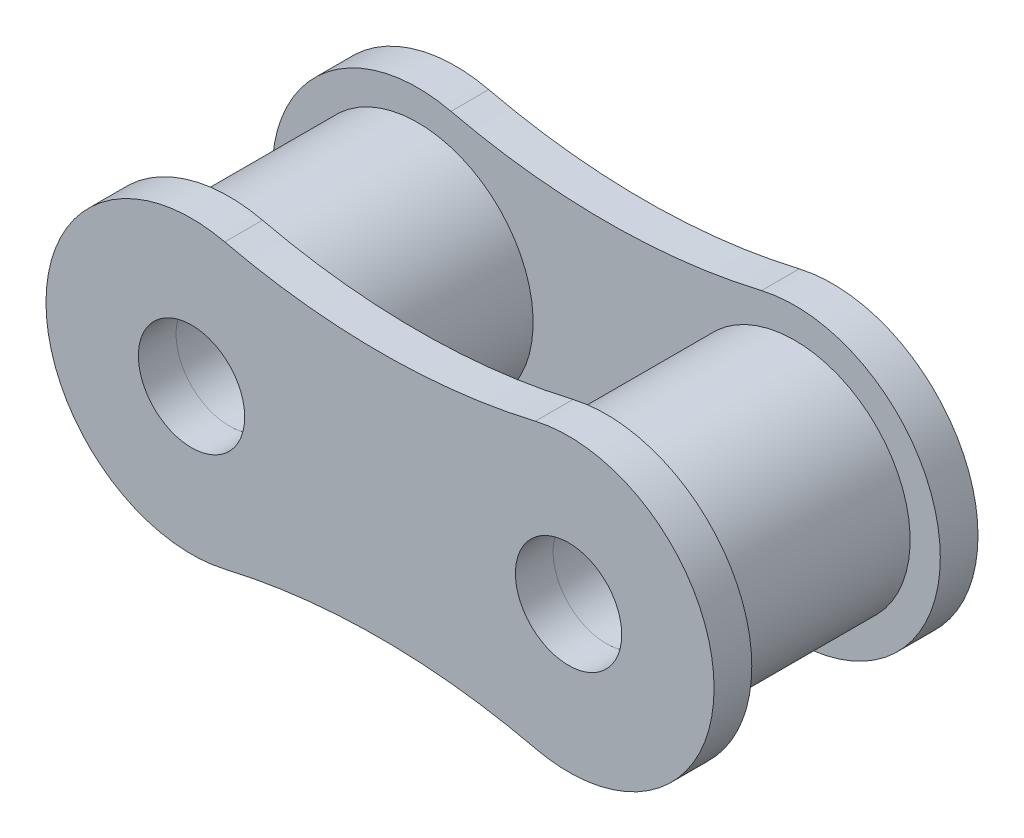
ISO-10303-21;
HEADER;
FILE_DESCRIPTION(('STEP AP214'),'2;1');
FILE_NAME('part.step','',(''),(''),'','','');
FILE_SCHEMA(('AUTOMOTIVE_DESIGN { 1 0 10303 214 1 1 1 1 }'));
ENDSEC;
DATA;
#1=APPLICATION_CONTEXT('core data for automotive mechanical design processes');
#2=APPLICATION_PROTOCOL_DEFINITION('international standard','automotive_design',2000,#1);
#3=PRODUCT_CONTEXT('',#1,'mechanical');
#4=PRODUCT('Part','Part','',(#3));
#5=PRODUCT_RELATED_PRODUCT_CATEGORY('part','',(#4));
#6=PRODUCT_DEFINITION_FORMATION('','',#4);
#7=PRODUCT_DEFINITION_CONTEXT('part definition',#1,'design');
#8=PRODUCT_DEFINITION('design','',#6,#7);
#9=PRODUCT_DEFINITION_SHAPE('','',#8);
#10=(LENGTH_UNIT() NAMED_UNIT(*) SI_UNIT(.MILLI.,.METRE.));
#11=(NAMED_UNIT(*) PLANE_ANGLE_UNIT() SI_UNIT($,.RADIAN.));
#12=(NAMED_UNIT(*) SI_UNIT($,.STERADIAN.) SOLID_ANGLE_UNIT());
#13=UNCERTAINTY_MEASURE_WITH_UNIT(LENGTH_MEASURE(1.E-05),#10,'distance_accuracy_value','');
#14=(GEOMETRIC_REPRESENTATION_CONTEXT(3) GLOBAL_UNCERTAINTY_ASSIGNED_CONTEXT((#13)) GLOBAL_UNIT_ASSIGNED_CONTEXT((#10,
#11,#12)) REPRESENTATION_CONTEXT('',''));
#15=CARTESIAN_POINT('',(0.,0.,0.));
#16=DIRECTION('',(0.,0.,1.));
#17=DIRECTION('',(1.,0.,0.));
#18=AXIS2_PLACEMENT_3D('',#15,#16,#17);
#19=CARTESIAN_POINT('',(3.175,13.5251485017271,-3.175));
#20=DIRECTION('',(0.,0.,-1.));
#21=DIRECTION('',(1.,0.,0.));
#22=AXIS2_PLACEMENT_3D('',#19,#20,#21);
#23=PLANE('',#22);
#24=CARTESIAN_POINT('',(0.,27.0502970034543,-3.175));
#25=DIRECTION('',(0.,0.,-1.));
#26=DIRECTION('',(1.,0.,0.));
#27=AXIS2_PLACEMENT_3D('',#24,#25,#26);
#28=CIRCLE('',#27,22.8834270034543);
#29=CARTESIAN_POINT('',(5.22967365299584,4.77246620901692,-3.175));
#30=VERTEX_POINT('',#29);
#31=CARTESIAN_POINT('',(-5.22967365299584,4.77246620901692,-3.175));
#32=VERTEX_POINT('',#31);
#33=EDGE_CURVE('E155',#30,#32,#28,.T.);
#34=ORIENTED_EDGE('',*,*,#33,.T.);
#35=CARTESIAN_POINT('',(-6.35,0.,-3.175));
#36=DIRECTION('',(0.,0.,1.));
#37=DIRECTION('',(1.,0.,0.));
#38=AXIS2_PLACEMENT_3D('',#35,#36,#37);
#39=CIRCLE('',#38,4.9022);
#40=CARTESIAN_POINT('',(-5.22967365299584,-4.77246620901692,-3.175));
#41=VERTEX_POINT('',#40);
#42=EDGE_CURVE('E169',#32,#41,#39,.T.);
#43=ORIENTED_EDGE('',*,*,#42,.T.);
#44=CARTESIAN_POINT('',(0.,-27.0502970034543,-3.175));
#45=DIRECTION('',(0.,0.,-1.));
#46=DIRECTION('',(1.,0.,0.));
#47=AXIS2_PLACEMENT_3D('',#44,#45,#46);
#48=CIRCLE('',#47,22.8834270034543);
#49=CARTESIAN_POINT('',(5.22967365299584,-4.77246620901691,-3.175));
#50=VERTEX_POINT('',#49);
#51=EDGE_CURVE('E172',#41,#50,#48,.T.);
#52=ORIENTED_EDGE('',*,*,#51,.T.);
#53=CARTESIAN_POINT('',(6.35,0.,-3.175));
#54=DIRECTION('',(0.,0.,1.));
#55=DIRECTION('',(1.,0.,0.));
#56=AXIS2_PLACEMENT_3D('',#53,#54,#55);
#57=CIRCLE('',#56,4.9022);
#58=EDGE_CURVE('E161',#50,#30,#57,.T.);
#59=ORIENTED_EDGE('',*,*,#58,.T.);
#60=EDGE_LOOP('',(#34,#43,#52,#59));
#61=FACE_BOUND('',#60,.T.);
#62=CARTESIAN_POINT('',(-6.35,0.,-3.175));
#63=DIRECTION('',(0.,0.,-1.));
#64=DIRECTION('',(-1.,0.,0.));
#65=AXIS2_PLACEMENT_3D('',#62,#63,#64);
#66=CIRCLE('',#65,3.8862);
#67=CARTESIAN_POINT('',(-10.2362,0.,-3.175));
#68=VERTEX_POINT('',#67);
#69=EDGE_CURVE('E43',#68,#68,#66,.F.);
#70=ORIENTED_EDGE('',*,*,#69,.F.);
#71=EDGE_LOOP('',(#70));
#72=FACE_BOUND('',#71,.T.);
#73=CARTESIAN_POINT('',(6.35,0.,-3.175));
#74=DIRECTION('',(0.,0.,-1.));
#75=DIRECTION('',(-1.,0.,0.));
#76=AXIS2_PLACEMENT_3D('',#73,#74,#75);
#77=CIRCLE('',#76,3.8862);
#78=CARTESIAN_POINT('',(2.4638,0.,-3.175));
#79=VERTEX_POINT('',#78);
#80=EDGE_CURVE('E11',#79,#79,#77,.F.);
#81=ORIENTED_EDGE('',*,*,#80,.F.);
#82=EDGE_LOOP('',(#81));
#83=FACE_BOUND('',#82,.T.);
#84=ADVANCED_FACE('F34',(#61,#72,#83),#23,.F.);
#85=CARTESIAN_POINT('',(6.35,0.,-3.175));
#86=DIRECTION('',(0.,0.,1.));
#87=DIRECTION('',(1.,0.,0.));
#88=AXIS2_PLACEMENT_3D('',#85,#86,#87);
#89=CIRCLE('',#88,1.8161);
#90=CARTESIAN_POINT('',(8.1661,0.,-3.175));
#91=VERTEX_POINT('',#90);
#92=EDGE_CURVE('E273',#91,#91,#89,.T.);
#93=ORIENTED_EDGE('',*,*,#92,.T.);
#94=EDGE_LOOP('',(#93));
#95=FACE_BOUND('',#94,.T.);
#96=CARTESIAN_POINT('',(6.35,0.,-3.175));
#97=DIRECTION('',(0.,0.,1.));
#98=DIRECTION('',(1.,0.,0.));
#99=AXIS2_PLACEMENT_3D('',#96,#97,#98);
#100=CIRCLE('',#99,1.7907);
#101=CARTESIAN_POINT('',(8.1407,0.,-3.175));
#102=VERTEX_POINT('',#101);
#103=EDGE_CURVE('E145',#102,#102,#100,.T.);
#104=ORIENTED_EDGE('',*,*,#103,.F.);
#105=EDGE_LOOP('',(#104));
#106=FACE_BOUND('',#105,.T.);
#107=ADVANCED_FACE('F187',(#95,#106),#23,.F.);
#108=CARTESIAN_POINT('',(3.175,13.5251485017271,-4.445));
#109=DIRECTION('',(0.,0.,-1.));
#110=DIRECTION('',(1.,0.,0.));
#111=AXIS2_PLACEMENT_3D('',#108,#109,#110);
#112=PLANE('',#111);
#113=CARTESIAN_POINT('',(-6.35,0.,-4.445));
#114=DIRECTION('',(0.,0.,1.));
#115=DIRECTION('',(1.,0.,0.));
#116=AXIS2_PLACEMENT_3D('',#113,#114,#115);
#117=CIRCLE('',#116,1.7907);
#118=CARTESIAN_POINT('',(-4.5593,0.,-4.445));
#119=VERTEX_POINT('',#118);
#120=EDGE_CURVE('E152',#119,#119,#117,.T.);
#121=ORIENTED_EDGE('',*,*,#120,.T.);
#122=EDGE_LOOP('',(#121));
#123=FACE_BOUND('',#122,.T.);
#124=CARTESIAN_POINT('',(0.,27.0502970034543,-4.445));
#125=DIRECTION('',(0.,0.,-1.));
#126=DIRECTION('',(1.,0.,0.));
#127=AXIS2_PLACEMENT_3D('',#124,#125,#126);
#128=CIRCLE('',#127,22.8834270034543);
#129=CARTESIAN_POINT('',(5.22967365299584,4.77246620901692,-4.445));
#130=VERTEX_POINT('',#129);
#131=CARTESIAN_POINT('',(-5.22967365299584,4.77246620901692,-4.445));
#132=VERTEX_POINT('',#131);
#133=EDGE_CURVE('E158',#130,#132,#128,.T.);
#134=ORIENTED_EDGE('',*,*,#133,.F.);
#135=CARTESIAN_POINT('',(6.35,0.,-4.445));
#136=DIRECTION('',(0.,0.,1.));
#137=DIRECTION('',(1.,0.,0.));
#138=AXIS2_PLACEMENT_3D('',#135,#136,#137);
#139=CIRCLE('',#138,4.9022);
#140=CARTESIAN_POINT('',(5.22967365299584,-4.77246620901691,-4.445));
#141=VERTEX_POINT('',#140);
#142=EDGE_CURVE('E165',#141,#130,#139,.T.);
#143=ORIENTED_EDGE('',*,*,#142,.F.);
#144=CARTESIAN_POINT('',(0.,-27.0502970034543,-4.445));
#145=DIRECTION('',(0.,0.,-1.));
#146=DIRECTION('',(1.,0.,0.));
#147=AXIS2_PLACEMENT_3D('',#144,#145,#146);
#148=CIRCLE('',#147,22.8834270034543);
#149=CARTESIAN_POINT('',(-5.22967365299584,-4.77246620901692,-4.445));
#150=VERTEX_POINT('',#149);
#151=EDGE_CURVE('E163',#150,#141,#148,.T.);
#152=ORIENTED_EDGE('',*,*,#151,.F.);
#153=CARTESIAN_POINT('',(-6.35,0.,-4.445));
#154=DIRECTION('',(0.,0.,1.));
#155=DIRECTION('',(1.,0.,0.));
#156=AXIS2_PLACEMENT_3D('',#153,#154,#155);
#157=CIRCLE('',#156,4.9022);
#158=EDGE_CURVE('E160',#132,#150,#157,.T.);
#159=ORIENTED_EDGE('',*,*,#158,.F.);
#160=EDGE_LOOP('',(#134,#143,#152,#159));
#161=FACE_BOUND('',#160,.T.);
#162=CARTESIAN_POINT('',(6.35,0.,-4.445));
#163=DIRECTION('',(0.,0.,1.));
#164=DIRECTION('',(1.,0.,0.));
#165=AXIS2_PLACEMENT_3D('',#162,#163,#164);
#166=CIRCLE('',#165,1.7907);
#167=CARTESIAN_POINT('',(8.1407,0.,-4.445));
#168=VERTEX_POINT('',#167);
#169=EDGE_CURVE('E146',#168,#168,#166,.T.);
#170=ORIENTED_EDGE('',*,*,#169,.T.);
#171=EDGE_LOOP('',(#170));
#172=FACE_BOUND('',#171,.T.);
#173=ADVANCED_FACE('F243',(#123,#161,#172),#112,.T.);
#174=CARTESIAN_POINT('',(-6.35,0.,-3.175));
#175=DIRECTION('',(0.,0.,1.));
#176=DIRECTION('',(1.,0.,0.));
#177=AXIS2_PLACEMENT_3D('',#174,#175,#176);
#178=CIRCLE('',#177,1.8161);
#179=CARTESIAN_POINT('',(-4.5339,0.,-3.175));
#180=VERTEX_POINT('',#179);
#181=EDGE_CURVE('E282',#180,#180,#178,.T.);
#182=ORIENTED_EDGE('',*,*,#181,.T.);
#183=EDGE_LOOP('',(#182));
#184=FACE_BOUND('',#183,.T.);
#185=CARTESIAN_POINT('',(-6.35,0.,-3.175));
#186=DIRECTION('',(0.,0.,1.));
#187=DIRECTION('',(1.,0.,0.));
#188=AXIS2_PLACEMENT_3D('',#185,#186,#187);
#189=CIRCLE('',#188,1.7907);
#190=CARTESIAN_POINT('',(-4.5593,0.,-3.175));
#191=VERTEX_POINT('',#190);
#192=EDGE_CURVE('E149',#191,#191,#189,.T.);
#193=ORIENTED_EDGE('',*,*,#192,.F.);
#194=EDGE_LOOP('',(#193));
#195=FACE_BOUND('',#194,.T.);
#196=ADVANCED_FACE('F190',(#184,#195),#23,.F.);
#197=CARTESIAN_POINT('',(0.,27.0502970034543,-4.445));
#198=DIRECTION('',(0.,0.,1.));
#199=DIRECTION('',(-1.,0.,0.));
#200=AXIS2_PLACEMENT_3D('',#197,#198,#199);
#201=CYLINDRICAL_SURFACE('',#200,22.8834270034543);
#202=ORIENTED_EDGE('',*,*,#33,.F.);
#203=DIRECTION('',(0.,0.,1.));
#204=VECTOR('',#203,1.);
#205=CARTESIAN_POINT('',(5.22967365299584,4.77246620901692,-4.445));
#206=LINE('',#205,#204);
#207=EDGE_CURVE('E51',#130,#30,#206,.T.);
#208=ORIENTED_EDGE('',*,*,#207,.F.);
#209=ORIENTED_EDGE('',*,*,#133,.T.);
#210=DIRECTION('',(0.,0.,1.));
#211=VECTOR('',#210,1.);
#212=CARTESIAN_POINT('',(-5.22967365299584,4.77246620901692,-4.445));
#213=LINE('',#212,#211);
#214=EDGE_CURVE('E79',#132,#32,#213,.T.);
#215=ORIENTED_EDGE('',*,*,#214,.T.);
#216=EDGE_LOOP('',(#202,#208,#209,#215));
#217=FACE_BOUND('',#216,.T.);
#218=ADVANCED_FACE('F36',(#217),#201,.F.);
#219=CARTESIAN_POINT('',(-6.35,0.,-4.445));
#220=DIRECTION('',(0.,0.,1.));
#221=DIRECTION('',(-1.,0.,0.));
#222=AXIS2_PLACEMENT_3D('',#219,#220,#221);
#223=CYLINDRICAL_SURFACE('',#222,4.9022);
#224=ORIENTED_EDGE('',*,*,#42,.F.);
#225=ORIENTED_EDGE('',*,*,#214,.F.);
#226=ORIENTED_EDGE('',*,*,#158,.T.);
#227=DIRECTION('',(0.,0.,1.));
#228=VECTOR('',#227,1.);
#229=CARTESIAN_POINT('',(-5.22967365299584,-4.77246620901692,-4.445));
#230=LINE('',#229,#228);
#231=EDGE_CURVE('E178',#150,#41,#230,.T.);
#232=ORIENTED_EDGE('',*,*,#231,.T.);
#233=EDGE_LOOP('',(#224,#225,#226,#232));
#234=FACE_BOUND('',#233,.T.);
#235=ADVANCED_FACE('F253',(#234),#223,.T.);
#236=CARTESIAN_POINT('',(0.,-27.0502970034543,-4.445));
#237=DIRECTION('',(0.,0.,1.));
#238=DIRECTION('',(-1.,0.,0.));
#239=AXIS2_PLACEMENT_3D('',#236,#237,#238);
#240=CYLINDRICAL_SURFACE('',#239,22.8834270034543);
#241=ORIENTED_EDGE('',*,*,#51,.F.);
#242=ORIENTED_EDGE('',*,*,#231,.F.);
#243=ORIENTED_EDGE('',*,*,#151,.T.);
#244=DIRECTION('',(0.,0.,1.));
#245=VECTOR('',#244,1.);
#246=CARTESIAN_POINT('',(5.22967365299584,-4.77246620901691,-4.445));
#247=LINE('',#246,#245);
#248=EDGE_CURVE('E69',#141,#50,#247,.T.);
#249=ORIENTED_EDGE('',*,*,#248,.T.);
#250=EDGE_LOOP('',(#241,#242,#243,#249));
#251=FACE_BOUND('',#250,.T.);
#252=ADVANCED_FACE('F251',(#251),#240,.F.);
#253=CARTESIAN_POINT('',(6.35,0.,-4.445));
#254=DIRECTION('',(0.,0.,1.));
#255=DIRECTION('',(-1.,0.,0.));
#256=AXIS2_PLACEMENT_3D('',#253,#254,#255);
#257=CYLINDRICAL_SURFACE('',#256,4.9022);
#258=ORIENTED_EDGE('',*,*,#58,.F.);
#259=ORIENTED_EDGE('',*,*,#248,.F.);
#260=ORIENTED_EDGE('',*,*,#142,.T.);
#261=ORIENTED_EDGE('',*,*,#207,.T.);
#262=EDGE_LOOP('',(#258,#259,#260,#261));
#263=FACE_BOUND('',#262,.T.);
#264=ADVANCED_FACE('F241',(#263),#257,.T.);
#265=CARTESIAN_POINT('',(-6.35,0.,-4.445));
#266=DIRECTION('',(0.,0.,1.));
#267=DIRECTION('',(-1.,0.,0.));
#268=AXIS2_PLACEMENT_3D('',#265,#266,#267);
#269=CYLINDRICAL_SURFACE('',#268,1.7907);
#270=ORIENTED_EDGE('',*,*,#120,.F.);
#271=EDGE_LOOP('',(#270));
#272=FACE_BOUND('',#271,.T.);
#273=ORIENTED_EDGE('',*,*,#192,.T.);
#274=EDGE_LOOP('',(#273));
#275=FACE_BOUND('',#274,.T.);
#276=ADVANCED_FACE('F237',(#272,#275),#269,.F.);
#277=CARTESIAN_POINT('',(6.35,0.,-4.445));
#278=DIRECTION('',(0.,0.,1.));
#279=DIRECTION('',(-1.,0.,0.));
#280=AXIS2_PLACEMENT_3D('',#277,#278,#279);
#281=CYLINDRICAL_SURFACE('',#280,1.7907);
#282=ORIENTED_EDGE('',*,*,#169,.F.);
#283=EDGE_LOOP('',(#282));
#284=FACE_BOUND('',#283,.T.);
#285=ORIENTED_EDGE('',*,*,#103,.T.);
#286=EDGE_LOOP('',(#285));
#287=FACE_BOUND('',#286,.T.);
#288=ADVANCED_FACE('F234',(#284,#287),#281,.F.);
#289=CARTESIAN_POINT('',(3.175,13.5251485017271,3.175));
#290=DIRECTION('',(0.,0.,1.));
#291=DIRECTION('',(1.,0.,0.));
#292=AXIS2_PLACEMENT_3D('',#289,#290,#291);
#293=PLANE('',#292);
#294=CARTESIAN_POINT('',(0.,27.0502970034543,3.175));
#295=DIRECTION('',(0.,0.,-1.));
#296=DIRECTION('',(1.,0.,0.));
#297=AXIS2_PLACEMENT_3D('',#294,#295,#296);
#298=CIRCLE('',#297,22.8834270034543);
#299=CARTESIAN_POINT('',(5.22967365299584,4.77246620901692,3.175));
#300=VERTEX_POINT('',#299);
#301=CARTESIAN_POINT('',(-5.22967365299584,4.77246620901692,3.175));
#302=VERTEX_POINT('',#301);
#303=EDGE_CURVE('E133',#300,#302,#298,.T.);
#304=ORIENTED_EDGE('',*,*,#303,.F.);
#305=CARTESIAN_POINT('',(6.35,0.,3.175));
#306=DIRECTION('',(0.,0.,1.));
#307=DIRECTION('',(1.,0.,0.));
#308=AXIS2_PLACEMENT_3D('',#305,#306,#307);
#309=CIRCLE('',#308,4.9022);
#310=CARTESIAN_POINT('',(5.22967365299584,-4.77246620901691,3.175));
#311=VERTEX_POINT('',#310);
#312=EDGE_CURVE('E129',#311,#300,#309,.T.);
#313=ORIENTED_EDGE('',*,*,#312,.F.);
#314=CARTESIAN_POINT('',(0.,-27.0502970034543,3.175));
#315=DIRECTION('',(0.,0.,-1.));
#316=DIRECTION('',(1.,0.,0.));
#317=AXIS2_PLACEMENT_3D('',#314,#315,#316);
#318=CIRCLE('',#317,22.8834270034543);
#319=CARTESIAN_POINT('',(-5.22967365299584,-4.77246620901692,3.175));
#320=VERTEX_POINT('',#319);
#321=EDGE_CURVE('E303',#320,#311,#318,.T.);
#322=ORIENTED_EDGE('',*,*,#321,.F.);
#323=CARTESIAN_POINT('',(-6.35,0.,3.175));
#324=DIRECTION('',(0.,0.,1.));
#325=DIRECTION('',(1.,0.,0.));
#326=AXIS2_PLACEMENT_3D('',#323,#324,#325);
#327=CIRCLE('',#326,4.9022);
#328=EDGE_CURVE('E301',#302,#320,#327,.T.);
#329=ORIENTED_EDGE('',*,*,#328,.F.);
#330=EDGE_LOOP('',(#304,#313,#322,#329));
#331=FACE_BOUND('',#330,.T.);
#332=CARTESIAN_POINT('',(6.35,0.,3.175));
#333=DIRECTION('',(0.,0.,1.));
#334=DIRECTION('',(1.,0.,0.));
#335=AXIS2_PLACEMENT_3D('',#332,#333,#334);
#336=CIRCLE('',#335,3.8862);
#337=CARTESIAN_POINT('',(10.2362,0.,3.175));
#338=VERTEX_POINT('',#337);
#339=EDGE_CURVE('E134',#338,#338,#336,.F.);
#340=ORIENTED_EDGE('',*,*,#339,.F.);
#341=EDGE_LOOP('',(#340));
#342=FACE_BOUND('',#341,.T.);
#343=CARTESIAN_POINT('',(-6.35,0.,3.175));
#344=DIRECTION('',(0.,0.,1.));
#345=DIRECTION('',(1.,0.,0.));
#346=AXIS2_PLACEMENT_3D('',#343,#344,#345);
#347=CIRCLE('',#346,3.8862);
#348=CARTESIAN_POINT('',(-2.4638,0.,3.175));
#349=VERTEX_POINT('',#348);
#350=EDGE_CURVE('E137',#349,#349,#347,.F.);
#351=ORIENTED_EDGE('',*,*,#350,.F.);
#352=EDGE_LOOP('',(#351));
#353=FACE_BOUND('',#352,.T.);
#354=ADVANCED_FACE('F222',(#331,#342,#353),#293,.F.);
#355=CARTESIAN_POINT('',(-6.35,0.,3.175));
#356=DIRECTION('',(0.,0.,1.));
#357=DIRECTION('',(1.,0.,0.));
#358=AXIS2_PLACEMENT_3D('',#355,#356,#357);
#359=CIRCLE('',#358,1.8161);
#360=CARTESIAN_POINT('',(-4.5339,0.,3.175));
#361=VERTEX_POINT('',#360);
#362=EDGE_CURVE('E276',#361,#361,#359,.T.);
#363=ORIENTED_EDGE('',*,*,#362,.F.);
#364=EDGE_LOOP('',(#363));
#365=FACE_BOUND('',#364,.T.);
#366=CARTESIAN_POINT('',(-6.35,0.,3.175));
#367=DIRECTION('',(0.,0.,1.));
#368=DIRECTION('',(1.,0.,0.));
#369=AXIS2_PLACEMENT_3D('',#366,#367,#368);
#370=CIRCLE('',#369,1.7907);
#371=CARTESIAN_POINT('',(-4.5593,0.,3.175));
#372=VERTEX_POINT('',#371);
#373=EDGE_CURVE('E289',#372,#372,#370,.T.);
#374=ORIENTED_EDGE('',*,*,#373,.T.);
#375=EDGE_LOOP('',(#374));
#376=FACE_BOUND('',#375,.T.);
#377=ADVANCED_FACE('F217',(#365,#376),#293,.F.);
#378=CARTESIAN_POINT('',(3.175,13.5251485017271,4.445));
#379=DIRECTION('',(0.,0.,1.));
#380=DIRECTION('',(1.,0.,0.));
#381=AXIS2_PLACEMENT_3D('',#378,#379,#380);
#382=PLANE('',#381);
#383=CARTESIAN_POINT('',(-6.35,0.,4.445));
#384=DIRECTION('',(0.,0.,1.));
#385=DIRECTION('',(1.,0.,0.));
#386=AXIS2_PLACEMENT_3D('',#383,#384,#385);
#387=CIRCLE('',#386,1.7907);
#388=CARTESIAN_POINT('',(-4.5593,0.,4.445));
#389=VERTEX_POINT('',#388);
#390=EDGE_CURVE('E292',#389,#389,#387,.T.);
#391=ORIENTED_EDGE('',*,*,#390,.F.);
#392=EDGE_LOOP('',(#391));
#393=FACE_BOUND('',#392,.T.);
#394=CARTESIAN_POINT('',(0.,27.0502970034543,4.445));
#395=DIRECTION('',(0.,0.,-1.));
#396=DIRECTION('',(1.,0.,0.));
#397=AXIS2_PLACEMENT_3D('',#394,#395,#396);
#398=CIRCLE('',#397,22.8834270034543);
#399=CARTESIAN_POINT('',(5.22967365299584,4.77246620901692,4.445));
#400=VERTEX_POINT('',#399);
#401=CARTESIAN_POINT('',(-5.22967365299584,4.77246620901692,4.445));
#402=VERTEX_POINT('',#401);
#403=EDGE_CURVE('E119',#400,#402,#398,.T.);
#404=ORIENTED_EDGE('',*,*,#403,.T.);
#405=CARTESIAN_POINT('',(-6.35,0.,4.445));
#406=DIRECTION('',(0.,0.,1.));
#407=DIRECTION('',(1.,0.,0.));
#408=AXIS2_PLACEMENT_3D('',#405,#406,#407);
#409=CIRCLE('',#408,4.9022);
#410=CARTESIAN_POINT('',(-5.22967365299584,-4.77246620901692,4.445));
#411=VERTEX_POINT('',#410);
#412=EDGE_CURVE('E108',#402,#411,#409,.T.);
#413=ORIENTED_EDGE('',*,*,#412,.T.);
#414=CARTESIAN_POINT('',(0.,-27.0502970034543,4.445));
#415=DIRECTION('',(0.,0.,-1.));
#416=DIRECTION('',(1.,0.,0.));
#417=AXIS2_PLACEMENT_3D('',#414,#415,#416);
#418=CIRCLE('',#417,22.8834270034543);
#419=CARTESIAN_POINT('',(5.22967365299584,-4.77246620901691,4.445));
#420=VERTEX_POINT('',#419);
#421=EDGE_CURVE('E118',#411,#420,#418,.T.);
#422=ORIENTED_EDGE('',*,*,#421,.T.);
#423=CARTESIAN_POINT('',(6.35,0.,4.445));
#424=DIRECTION('',(0.,0.,1.));
#425=DIRECTION('',(1.,0.,0.));
#426=AXIS2_PLACEMENT_3D('',#423,#424,#425);
#427=CIRCLE('',#426,4.9022);
#428=EDGE_CURVE('E125',#420,#400,#427,.T.);
#429=ORIENTED_EDGE('',*,*,#428,.T.);
#430=EDGE_LOOP('',(#404,#413,#422,#429));
#431=FACE_BOUND('',#430,.T.);
#432=CARTESIAN_POINT('',(6.35,0.,4.445));
#433=DIRECTION('',(0.,0.,1.));
#434=DIRECTION('',(1.,0.,0.));
#435=AXIS2_PLACEMENT_3D('',#432,#433,#434);
#436=CIRCLE('',#435,1.7907);
#437=CARTESIAN_POINT('',(8.1407,0.,4.445));
#438=VERTEX_POINT('',#437);
#439=EDGE_CURVE('E286',#438,#438,#436,.T.);
#440=ORIENTED_EDGE('',*,*,#439,.F.);
#441=EDGE_LOOP('',(#440));
#442=FACE_BOUND('',#441,.T.);
#443=ADVANCED_FACE('F122',(#393,#431,#442),#382,.T.);
#444=CARTESIAN_POINT('',(6.35,0.,3.175));
#445=DIRECTION('',(0.,0.,1.));
#446=DIRECTION('',(1.,0.,0.));
#447=AXIS2_PLACEMENT_3D('',#444,#445,#446);
#448=CIRCLE('',#447,1.8161);
#449=CARTESIAN_POINT('',(8.1661,0.,3.175));
#450=VERTEX_POINT('',#449);
#451=EDGE_CURVE('E275',#450,#450,#448,.T.);
#452=ORIENTED_EDGE('',*,*,#451,.F.);
#453=EDGE_LOOP('',(#452));
#454=FACE_BOUND('',#453,.T.);
#455=CARTESIAN_POINT('',(6.35,0.,3.175));
#456=DIRECTION('',(0.,0.,1.));
#457=DIRECTION('',(1.,0.,0.));
#458=AXIS2_PLACEMENT_3D('',#455,#456,#457);
#459=CIRCLE('',#458,1.7907);
#460=CARTESIAN_POINT('',(8.1407,0.,3.175));
#461=VERTEX_POINT('',#460);
#462=EDGE_CURVE('E279',#461,#461,#459,.T.);
#463=ORIENTED_EDGE('',*,*,#462,.T.);
#464=EDGE_LOOP('',(#463));
#465=FACE_BOUND('',#464,.T.);
#466=ADVANCED_FACE('F216',(#454,#465),#293,.F.);
#467=CARTESIAN_POINT('',(0.,27.0502970034543,4.445));
#468=DIRECTION('',(0.,0.,-1.));
#469=DIRECTION('',(-1.,0.,0.));
#470=AXIS2_PLACEMENT_3D('',#467,#468,#469);
#471=CYLINDRICAL_SURFACE('',#470,22.8834270034543);
#472=ORIENTED_EDGE('',*,*,#303,.T.);
#473=DIRECTION('',(0.,0.,-1.));
#474=VECTOR('',#473,1.);
#475=CARTESIAN_POINT('',(-5.22967365299584,4.77246620901692,4.445));
#476=LINE('',#475,#474);
#477=EDGE_CURVE('E112',#402,#302,#476,.T.);
#478=ORIENTED_EDGE('',*,*,#477,.F.);
#479=ORIENTED_EDGE('',*,*,#403,.F.);
#480=DIRECTION('',(0.,0.,-1.));
#481=VECTOR('',#480,1.);
#482=CARTESIAN_POINT('',(5.22967365299584,4.77246620901692,4.445));
#483=LINE('',#482,#481);
#484=EDGE_CURVE('E299',#400,#300,#483,.T.);
#485=ORIENTED_EDGE('',*,*,#484,.T.);
#486=EDGE_LOOP('',(#472,#478,#479,#485));
#487=FACE_BOUND('',#486,.T.);
#488=ADVANCED_FACE('F131',(#487),#471,.F.);
#489=CARTESIAN_POINT('',(-6.35,0.,4.445));
#490=DIRECTION('',(0.,0.,-1.));
#491=DIRECTION('',(-1.,0.,0.));
#492=AXIS2_PLACEMENT_3D('',#489,#490,#491);
#493=CYLINDRICAL_SURFACE('',#492,4.9022);
#494=ORIENTED_EDGE('',*,*,#328,.T.);
#495=DIRECTION('',(0.,0.,-1.));
#496=VECTOR('',#495,1.);
#497=CARTESIAN_POINT('',(-5.22967365299584,-4.77246620901692,4.445));
#498=LINE('',#497,#496);
#499=EDGE_CURVE('E115',#411,#320,#498,.T.);
#500=ORIENTED_EDGE('',*,*,#499,.F.);
#501=ORIENTED_EDGE('',*,*,#412,.F.);
#502=ORIENTED_EDGE('',*,*,#477,.T.);
#503=EDGE_LOOP('',(#494,#500,#501,#502));
#504=FACE_BOUND('',#503,.T.);
#505=ADVANCED_FACE('F110',(#504),#493,.T.);
#506=CARTESIAN_POINT('',(0.,-27.0502970034543,4.445));
#507=DIRECTION('',(0.,0.,-1.));
#508=DIRECTION('',(-1.,0.,0.));
#509=AXIS2_PLACEMENT_3D('',#506,#507,#508);
#510=CYLINDRICAL_SURFACE('',#509,22.8834270034543);
#511=ORIENTED_EDGE('',*,*,#321,.T.);
#512=DIRECTION('',(0.,0.,-1.));
#513=VECTOR('',#512,1.);
#514=CARTESIAN_POINT('',(5.22967365299584,-4.77246620901691,4.445));
#515=LINE('',#514,#513);
#516=EDGE_CURVE('E139',#420,#311,#515,.T.);
#517=ORIENTED_EDGE('',*,*,#516,.F.);
#518=ORIENTED_EDGE('',*,*,#421,.F.);
#519=ORIENTED_EDGE('',*,*,#499,.T.);
#520=EDGE_LOOP('',(#511,#517,#518,#519));
#521=FACE_BOUND('',#520,.T.);
#522=ADVANCED_FACE('F225',(#521),#510,.F.);
#523=CARTESIAN_POINT('',(6.35,0.,4.445));
#524=DIRECTION('',(0.,0.,-1.));
#525=DIRECTION('',(-1.,0.,0.));
#526=AXIS2_PLACEMENT_3D('',#523,#524,#525);
#527=CYLINDRICAL_SURFACE('',#526,4.9022);
#528=ORIENTED_EDGE('',*,*,#312,.T.);
#529=ORIENTED_EDGE('',*,*,#484,.F.);
#530=ORIENTED_EDGE('',*,*,#428,.F.);
#531=ORIENTED_EDGE('',*,*,#516,.T.);
#532=EDGE_LOOP('',(#528,#529,#530,#531));
#533=FACE_BOUND('',#532,.T.);
#534=ADVANCED_FACE('F212',(#533),#527,.T.);
#535=CARTESIAN_POINT('',(-6.35,0.,4.445));
#536=DIRECTION('',(0.,0.,-1.));
#537=DIRECTION('',(-1.,0.,0.));
#538=AXIS2_PLACEMENT_3D('',#535,#536,#537);
#539=CYLINDRICAL_SURFACE('',#538,1.7907);
#540=ORIENTED_EDGE('',*,*,#390,.T.);
#541=EDGE_LOOP('',(#540));
#542=FACE_BOUND('',#541,.T.);
#543=ORIENTED_EDGE('',*,*,#373,.F.);
#544=EDGE_LOOP('',(#543));
#545=FACE_BOUND('',#544,.T.);
#546=ADVANCED_FACE('F205',(#542,#545),#539,.F.);
#547=CARTESIAN_POINT('',(6.35,0.,4.445));
#548=DIRECTION('',(0.,0.,-1.));
#549=DIRECTION('',(-1.,0.,0.));
#550=AXIS2_PLACEMENT_3D('',#547,#548,#549);
#551=CYLINDRICAL_SURFACE('',#550,1.7907);
#552=ORIENTED_EDGE('',*,*,#439,.T.);
#553=EDGE_LOOP('',(#552));
#554=FACE_BOUND('',#553,.T.);
#555=ORIENTED_EDGE('',*,*,#462,.F.);
#556=EDGE_LOOP('',(#555));
#557=FACE_BOUND('',#556,.T.);
#558=ADVANCED_FACE('F196',(#554,#557),#551,.F.);
#559=CARTESIAN_POINT('',(6.35,0.,3.175));
#560=DIRECTION('',(0.,0.,-1.));
#561=DIRECTION('',(-1.,0.,0.));
#562=AXIS2_PLACEMENT_3D('',#559,#560,#561);
#563=CYLINDRICAL_SURFACE('',#562,3.8862);
#564=ORIENTED_EDGE('',*,*,#339,.T.);
#565=EDGE_LOOP('',(#564));
#566=FACE_BOUND('',#565,.T.);
#567=ORIENTED_EDGE('',*,*,#80,.T.);
#568=EDGE_LOOP('',(#567));
#569=FACE_BOUND('',#568,.T.);
#570=ADVANCED_FACE('F193',(#566,#569),#563,.T.);
#571=CARTESIAN_POINT('',(6.35,0.,3.175));
#572=DIRECTION('',(0.,0.,-1.));
#573=DIRECTION('',(-1.,0.,0.));
#574=AXIS2_PLACEMENT_3D('',#571,#572,#573);
#575=CYLINDRICAL_SURFACE('',#574,1.8161);
#576=ORIENTED_EDGE('',*,*,#451,.T.);
#577=EDGE_LOOP('',(#576));
#578=FACE_BOUND('',#577,.T.);
#579=ORIENTED_EDGE('',*,*,#92,.F.);
#580=EDGE_LOOP('',(#579));
#581=FACE_BOUND('',#580,.T.);
#582=ADVANCED_FACE('F195',(#578,#581),#575,.F.);
#583=CARTESIAN_POINT('',(-6.35,0.,3.175));
#584=DIRECTION('',(0.,0.,-1.));
#585=DIRECTION('',(-1.,0.,0.));
#586=AXIS2_PLACEMENT_3D('',#583,#584,#585);
#587=CYLINDRICAL_SURFACE('',#586,3.8862);
#588=ORIENTED_EDGE('',*,*,#350,.T.);
#589=EDGE_LOOP('',(#588));
#590=FACE_BOUND('',#589,.T.);
#591=ORIENTED_EDGE('',*,*,#69,.T.);
#592=EDGE_LOOP('',(#591));
#593=FACE_BOUND('',#592,.T.);
#594=ADVANCED_FACE('F183',(#590,#593),#587,.T.);
#595=CARTESIAN_POINT('',(-6.35,0.,3.175));
#596=DIRECTION('',(0.,0.,-1.));
#597=DIRECTION('',(-1.,0.,0.));
#598=AXIS2_PLACEMENT_3D('',#595,#596,#597);
#599=CYLINDRICAL_SURFACE('',#598,1.8161);
#600=ORIENTED_EDGE('',*,*,#362,.T.);
#601=EDGE_LOOP('',(#600));
#602=FACE_BOUND('',#601,.T.);
#603=ORIENTED_EDGE('',*,*,#181,.F.);
#604=EDGE_LOOP('',(#603));
#605=FACE_BOUND('',#604,.T.);
#606=ADVANCED_FACE('F318',(#602,#605),#599,.F.);
#607=CLOSED_SHELL('',(#84,#107,#173,#196,#218,#235,#252,#264,#276,#288,#354,#377,#443,#466,#488,
#505,#522,#534,#546,#558,#570,#582,#594,#606));
#608=MANIFOLD_SOLID_BREP('B2',#607);
#609=ADVANCED_BREP_SHAPE_REPRESENTATION('',(#18,#608),#14);
#610=SHAPE_DEFINITION_REPRESENTATION(#9,#609);
ENDSEC;
END-ISO-10303-21;
